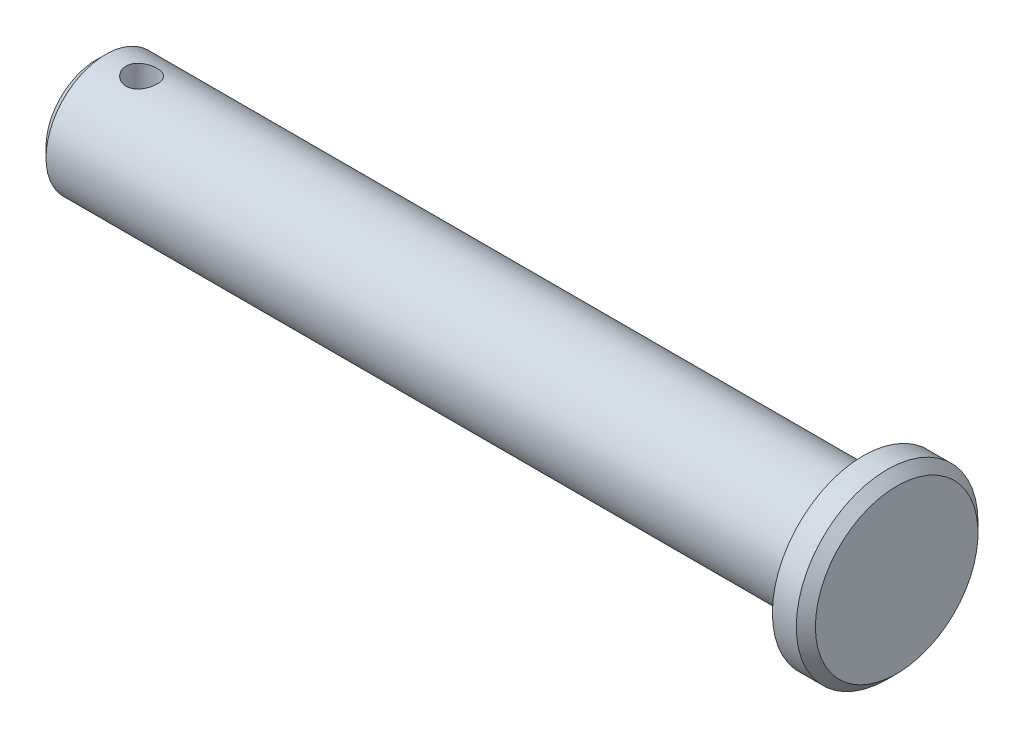
ISO-10303-21;
HEADER;
FILE_DESCRIPTION(('STEP AP214'),'2;1');
FILE_NAME('part.step','',(''),(''),'','','');
FILE_SCHEMA(('AUTOMOTIVE_DESIGN { 1 0 10303 214 1 1 1 1 }'));
ENDSEC;
DATA;
#1=APPLICATION_CONTEXT('core data for automotive mechanical design processes');
#2=APPLICATION_PROTOCOL_DEFINITION('international standard','automotive_design',2000,#1);
#3=PRODUCT_CONTEXT('',#1,'mechanical');
#4=PRODUCT('Part','Part','',(#3));
#5=PRODUCT_RELATED_PRODUCT_CATEGORY('part','',(#4));
#6=PRODUCT_DEFINITION_FORMATION('','',#4);
#7=PRODUCT_DEFINITION_CONTEXT('part definition',#1,'design');
#8=PRODUCT_DEFINITION('design','',#6,#7);
#9=PRODUCT_DEFINITION_SHAPE('','',#8);
#10=(LENGTH_UNIT() NAMED_UNIT(*) SI_UNIT(.MILLI.,.METRE.));
#11=(NAMED_UNIT(*) PLANE_ANGLE_UNIT() SI_UNIT($,.RADIAN.));
#12=(NAMED_UNIT(*) SI_UNIT($,.STERADIAN.) SOLID_ANGLE_UNIT());
#13=UNCERTAINTY_MEASURE_WITH_UNIT(LENGTH_MEASURE(1.E-05),#10,'distance_accuracy_value','');
#14=(GEOMETRIC_REPRESENTATION_CONTEXT(3) GLOBAL_UNCERTAINTY_ASSIGNED_CONTEXT((#13)) GLOBAL_UNIT_ASSIGNED_CONTEXT((#10,
#11,#12)) REPRESENTATION_CONTEXT('',''));
#15=CARTESIAN_POINT('',(0.,0.,0.));
#16=DIRECTION('',(0.,0.,1.));
#17=DIRECTION('',(1.,0.,0.));
#18=AXIS2_PLACEMENT_3D('',#15,#16,#17);
#19=CARTESIAN_POINT('',(83.69,0.,0.));
#20=DIRECTION('',(-1.,0.,0.));
#21=DIRECTION('',(0.,0.,1.));
#22=AXIS2_PLACEMENT_3D('',#19,#20,#21);
#23=PLANE('',#22);
#24=CARTESIAN_POINT('',(83.69,0.,0.));
#25=DIRECTION('',(-1.,0.,0.));
#26=DIRECTION('',(0.,0.,1.));
#27=AXIS2_PLACEMENT_3D('',#24,#25,#26);
#28=CIRCLE('',#27,17.);
#29=CARTESIAN_POINT('',(83.69,0.,17.));
#30=VERTEX_POINT('',#29);
#31=EDGE_CURVE('E10',#30,#30,#28,.T.);
#32=ORIENTED_EDGE('',*,*,#31,.F.);
#33=EDGE_LOOP('',(#32));
#34=FACE_BOUND('',#33,.T.);
#35=ADVANCED_FACE('F37',(#34),#23,.F.);
#36=CARTESIAN_POINT('',(83.69,0.,0.));
#37=DIRECTION('',(-1.,0.,0.));
#38=DIRECTION('',(0.,0.,1.));
#39=AXIS2_PLACEMENT_3D('',#36,#37,#38);
#40=CONICAL_SURFACE('',#39,17.,0.785398163397454);
#41=CARTESIAN_POINT('',(81.69,0.,0.));
#42=DIRECTION('',(-1.,0.,0.));
#43=DIRECTION('',(0.,0.,1.));
#44=AXIS2_PLACEMENT_3D('',#41,#42,#43);
#45=CIRCLE('',#44,19.);
#46=CARTESIAN_POINT('',(81.69,0.,19.));
#47=VERTEX_POINT('',#46);
#48=EDGE_CURVE('E49',#47,#47,#45,.T.);
#49=ORIENTED_EDGE('',*,*,#48,.F.);
#50=EDGE_LOOP('',(#49));
#51=FACE_BOUND('',#50,.T.);
#52=ORIENTED_EDGE('',*,*,#31,.T.);
#53=EDGE_LOOP('',(#52));
#54=FACE_BOUND('',#53,.T.);
#55=ADVANCED_FACE('F87',(#51,#54),#40,.T.);
#56=CARTESIAN_POINT('',(-83.69,0.,0.));
#57=DIRECTION('',(-1.,0.,0.));
#58=DIRECTION('',(0.,0.,1.));
#59=AXIS2_PLACEMENT_3D('',#56,#57,#58);
#60=CYLINDRICAL_SURFACE('',#59,19.);
#61=CARTESIAN_POINT('',(76.69,0.,0.));
#62=DIRECTION('',(-1.,0.,0.));
#63=DIRECTION('',(0.,0.,1.));
#64=AXIS2_PLACEMENT_3D('',#61,#62,#63);
#65=CIRCLE('',#64,19.);
#66=CARTESIAN_POINT('',(76.69,0.,19.));
#67=VERTEX_POINT('',#66);
#68=EDGE_CURVE('E54',#67,#67,#65,.T.);
#69=ORIENTED_EDGE('',*,*,#68,.F.);
#70=EDGE_LOOP('',(#69));
#71=FACE_BOUND('',#70,.T.);
#72=ORIENTED_EDGE('',*,*,#48,.T.);
#73=EDGE_LOOP('',(#72));
#74=FACE_BOUND('',#73,.T.);
#75=ADVANCED_FACE('F92',(#71,#74),#60,.T.);
#76=CARTESIAN_POINT('',(76.69,19.,0.));
#77=DIRECTION('',(1.,0.,0.));
#78=DIRECTION('',(0.,0.,-1.));
#79=AXIS2_PLACEMENT_3D('',#76,#77,#78);
#80=PLANE('',#79);
#81=CARTESIAN_POINT('',(76.69,0.,0.));
#82=DIRECTION('',(-1.,0.,0.));
#83=DIRECTION('',(0.,0.,1.));
#84=AXIS2_PLACEMENT_3D('',#81,#82,#83);
#85=CIRCLE('',#84,12.5);
#86=CARTESIAN_POINT('',(76.69,0.,12.5));
#87=VERTEX_POINT('',#86);
#88=EDGE_CURVE('E106',#87,#87,#85,.T.);
#89=ORIENTED_EDGE('',*,*,#88,.F.);
#90=EDGE_LOOP('',(#89));
#91=FACE_BOUND('',#90,.T.);
#92=ORIENTED_EDGE('',*,*,#68,.T.);
#93=EDGE_LOOP('',(#92));
#94=FACE_BOUND('',#93,.T.);
#95=ADVANCED_FACE('F82',(#91,#94),#80,.F.);
#96=CARTESIAN_POINT('',(-83.69,0.,0.));
#97=DIRECTION('',(-1.,0.,0.));
#98=DIRECTION('',(0.,0.,1.));
#99=AXIS2_PLACEMENT_3D('',#96,#97,#98);
#100=CYLINDRICAL_SURFACE('',#99,12.5);
#101=CARTESIAN_POINT('',(-74.19,-12.0701077045733,3.25000000000001));
#102=CARTESIAN_POINT('',(-74.0107885954813,-12.0701109573982,3.24999535178113));
#103=CARTESIAN_POINT('',(-73.8315271110855,-12.0741425908511,3.23512639697315));
#104=CARTESIAN_POINT('',(-73.4781693023618,-12.0897881676305,3.17614884790338));
#105=CARTESIAN_POINT('',(-73.3040757890962,-12.1014061612356,3.13202463437075));
#106=CARTESIAN_POINT('',(-72.9662164630232,-12.1308216935703,3.01607533822269));
#107=CARTESIAN_POINT('',(-72.8024369652352,-12.1486108310136,2.94428790118148));
#108=CARTESIAN_POINT('',(-72.4892235998337,-12.188353656464,2.77516657772717));
#109=CARTESIAN_POINT('',(-72.3397906438448,-12.210307608853,2.6778310693744));
#110=CARTESIAN_POINT('',(-72.0559577814269,-12.2564913332899,2.45790196762269));
#111=CARTESIAN_POINT('',(-71.9219495733315,-12.280759850753,2.33481089596256));
#112=CARTESIAN_POINT('',(-71.6762280196932,-12.3285031518504,2.06793534575671));
#113=CARTESIAN_POINT('',(-71.5645168911415,-12.3519778563635,1.92414881191203));
#114=CARTESIAN_POINT('',(-71.3649397364803,-12.3959194289913,1.61726111047983));
#115=CARTESIAN_POINT('',(-71.2774612447029,-12.4163352528835,1.45389997653955));
#116=CARTESIAN_POINT('',(-71.1313568196019,-12.4514152229144,1.11417056289528));
#117=CARTESIAN_POINT('',(-71.0727262699012,-12.4660802892388,0.937804369516636));
#118=CARTESIAN_POINT('',(-70.9872444185742,-12.4877324473615,0.581157741498521));
#119=CARTESIAN_POINT('',(-70.9597272679288,-12.4948801723699,0.401046821083342));
#120=CARTESIAN_POINT('',(-70.9351604063271,-12.5012531662289,0.0386327508821765));
#121=CARTESIAN_POINT('',(-70.9381058382885,-12.5004796980681,-0.143670044792213));
#122=CARTESIAN_POINT('',(-70.9739075642838,-12.4912159156495,-0.50066512385632));
#123=CARTESIAN_POINT('',(-71.0060447432983,-12.4829111371108,-0.6754350698673));
#124=CARTESIAN_POINT('',(-71.0981583408352,-12.4597356136684,-1.0170108145033));
#125=CARTESIAN_POINT('',(-71.1581363058879,-12.4448645040133,-1.18381617013483));
#126=CARTESIAN_POINT('',(-71.3047924979954,-12.4099485405509,-1.50658740876954));
#127=CARTESIAN_POINT('',(-71.3917209788508,-12.3898554928598,-1.66243415738996));
#128=CARTESIAN_POINT('',(-71.5896194759968,-12.3466665928588,-1.9575762183214));
#129=CARTESIAN_POINT('',(-71.7005939759614,-12.3235701808565,-2.09686843632711));
#130=CARTESIAN_POINT('',(-71.9472671863206,-12.2760868825507,-2.35923845302994));
#131=CARTESIAN_POINT('',(-72.08359361736,-12.2516820085968,-2.48172349723348));
#132=CARTESIAN_POINT('',(-72.3751060251362,-12.2049448337488,-2.702232859288));
#133=CARTESIAN_POINT('',(-72.5302930370178,-12.1826126467309,-2.80025583365963));
#134=CARTESIAN_POINT('',(-72.8563566235132,-12.1424802811445,-2.96948026869847));
#135=CARTESIAN_POINT('',(-73.0273163418386,-12.1247062331819,-3.04052815701658));
#136=CARTESIAN_POINT('',(-73.3793297967005,-12.0960312749224,-3.15268381624372));
#137=CARTESIAN_POINT('',(-73.5603811605704,-12.0851287564037,-3.19379859308707));
#138=CARTESIAN_POINT('',(-73.9219138101008,-12.0717718519797,-3.24391476190108));
#139=CARTESIAN_POINT('',(-74.1022645433665,-12.0690857581667,-3.25379719756266));
#140=CARTESIAN_POINT('',(-74.4620402014958,-12.0718332019216,-3.24358933567582));
#141=CARTESIAN_POINT('',(-74.6414652175856,-12.0772659234555,-3.22350205042832));
#142=CARTESIAN_POINT('',(-74.9909519843272,-12.0954157697153,-3.15469998588877));
#143=CARTESIAN_POINT('',(-75.1611242389842,-12.1079997596083,-3.10650801182699));
#144=CARTESIAN_POINT('',(-75.4909723579425,-12.1389056713158,-2.98344905344029));
#145=CARTESIAN_POINT('',(-75.6506468993668,-12.1572283146206,-2.90857871482456));
#146=CARTESIAN_POINT('',(-75.9586722501889,-12.1980276011193,-2.73247717350931));
#147=CARTESIAN_POINT('',(-76.1067143520271,-12.2205834904775,-2.63072477625171));
#148=CARTESIAN_POINT('',(-76.3839462489922,-12.2671181282773,-2.4043987998912));
#149=CARTESIAN_POINT('',(-76.5131326744878,-12.2910971299641,-2.27982115071729));
#150=CARTESIAN_POINT('',(-76.7526073691843,-12.3385688083207,-2.00731864410624));
#151=CARTESIAN_POINT('',(-76.8622832262937,-12.3620303224023,-1.85884911980557));
#152=CARTESIAN_POINT('',(-77.0551513294656,-12.4051491994823,-1.54509249859946));
#153=CARTESIAN_POINT('',(-77.1383449788849,-12.4248067640396,-1.37980629346376));
#154=CARTESIAN_POINT('',(-77.2751385963343,-12.4579769251599,-1.03826690311396));
#155=CARTESIAN_POINT('',(-77.3289567863995,-12.471534699114,-0.86210571803438));
#156=CARTESIAN_POINT('',(-77.4061145152478,-12.4911761164616,-0.502837049160071));
#157=CARTESIAN_POINT('',(-77.4294604508988,-12.4972613285118,-0.319731031562752));
#158=CARTESIAN_POINT('',(-77.4446267651941,-12.5012019892906,0.042495413320657));
#159=CARTESIAN_POINT('',(-77.4373476432301,-12.4992925217517,0.221576127725296));
#160=CARTESIAN_POINT('',(-77.3935498152793,-12.4879858018465,0.575871036634166));
#161=CARTESIAN_POINT('',(-77.3570321118936,-12.4785888062302,0.751085363506481));
#162=CARTESIAN_POINT('',(-77.2562925313222,-12.4534054132527,1.09164766573276));
#163=CARTESIAN_POINT('',(-77.1922453146038,-12.4376593358794,1.257050484072));
#164=CARTESIAN_POINT('',(-77.0384215044186,-12.4014288567053,1.57485660758888));
#165=CARTESIAN_POINT('',(-76.9486414449483,-12.3809438166767,1.7272581580113));
#166=CARTESIAN_POINT('',(-76.7432198655677,-12.3367798925157,2.01895989700419));
#167=CARTESIAN_POINT('',(-76.6269755695591,-12.3130327153406,2.15782524431701));
#168=CARTESIAN_POINT('',(-76.3730795014073,-12.2653095573742,2.41438331885254));
#169=CARTESIAN_POINT('',(-76.2354221916498,-12.2413335189069,2.53207055217989));
#170=CARTESIAN_POINT('',(-75.9391930313259,-12.1953008053636,2.74532550015592));
#171=CARTESIAN_POINT('',(-75.7802485671912,-12.1732938799442,2.84038727425697));
#172=CARTESIAN_POINT('',(-75.4480819265396,-12.1343795273366,3.0023016148278));
#173=CARTESIAN_POINT('',(-75.2748696190876,-12.1174686123345,3.06917348760505));
#174=CARTESIAN_POINT('',(-74.950129694205,-12.0931300782527,3.16356306125911));
#175=CARTESIAN_POINT('',(-74.8000714178756,-12.0845645189861,3.19590306708418));
#176=CARTESIAN_POINT('',(-74.4966874302689,-12.0730522257394,3.23912243522354));
#177=CARTESIAN_POINT('',(-74.3433620525361,-12.070104920934,3.25000397776242));
#178=CARTESIAN_POINT('',(-74.19,-12.0701077045733,3.25000000000001));
#179=B_SPLINE_CURVE_WITH_KNOTS('',3,(#101,#102,#103,#104,#105,#106,#107,#108,#109,#110,#111,
#112,#113,#114,#115,#116,#117,#118,#119,#120,#121,#122,#123,#124,#125,#126,#127,#128,#129,#130,
#131,#132,#133,#134,#135,#136,#137,#138,#139,#140,#141,#142,#143,#144,#145,#146,#147,#148,#149,
#150,#151,#152,#153,#154,#155,#156,#157,#158,#159,#160,#161,#162,#163,#164,#165,#166,#167,#168,
#169,#170,#171,#172,#173,#174,#175,#176,#177,#178),.UNSPECIFIED.,.T.,.F.,(4,2,2,2,2,2,2,2,2,2,2,
2,2,2,2,2,2,2,2,2,2,2,2,2,2,2,2,2,2,2,2,2,2,2,2,2,2,2,4),(0.,0.537070585366152,1.07442814181089,
1.61105700156233,2.14771993786828,2.69590642873234,3.2441473984725,3.80070711961765,
4.35717774859145,4.90149970278471,5.44573486933554,5.97691640068851,6.50812744222307,
7.04442685876538,7.58082636107377,8.13290034432251,8.6850046413125,9.240206612548,
9.79527859528774,10.3345457987712,10.8737588033625,11.4032475650857,11.9328029233325,
12.4734934119642,13.0142804074905,13.5698352862046,14.125360719806,14.67670111084,
15.2279257434832,15.7630571972261,16.2981703019111,16.8299373742636,17.3617761049811,
17.9072189278757,18.4528030428377,19.0096330020194,19.5660809852347,20.025731515924,
20.4853353427546),.UNSPECIFIED.);
#180=CARTESIAN_POINT('',(-74.19,-12.0701077045733,3.25000000000001));
#181=VERTEX_POINT('',#180);
#182=EDGE_CURVE('E40',#181,#181,#179,.T.);
#183=ORIENTED_EDGE('',*,*,#182,.T.);
#184=EDGE_LOOP('',(#183));
#185=FACE_BOUND('',#184,.T.);
#186=CARTESIAN_POINT('',(-74.19,12.0701077045733,3.25000000000001));
#187=CARTESIAN_POINT('',(-74.3692114045187,12.0701109573982,3.24999535178113));
#188=CARTESIAN_POINT('',(-74.5484728889145,12.0741425908511,3.23512639697315));
#189=CARTESIAN_POINT('',(-74.9018306976382,12.0897881676305,3.17614884790338));
#190=CARTESIAN_POINT('',(-75.0759242109038,12.1014061612356,3.13202463437075));
#191=CARTESIAN_POINT('',(-75.4137835369768,12.1308216935703,3.01607533822269));
#192=CARTESIAN_POINT('',(-75.5775630347649,12.1486108310136,2.94428790118148));
#193=CARTESIAN_POINT('',(-75.8907764001663,12.188353656464,2.77516657772717));
#194=CARTESIAN_POINT('',(-76.0402093561552,12.210307608853,2.6778310693744));
#195=CARTESIAN_POINT('',(-76.3240422185731,12.2564913332899,2.45790196762269));
#196=CARTESIAN_POINT('',(-76.4580504266685,12.280759850753,2.33481089596256));
#197=CARTESIAN_POINT('',(-76.7037719803068,12.3285031518504,2.06793534575671));
#198=CARTESIAN_POINT('',(-76.8154831088586,12.3519778563635,1.92414881191203));
#199=CARTESIAN_POINT('',(-77.0150602635197,12.3959194289913,1.61726111047983));
#200=CARTESIAN_POINT('',(-77.1025387552971,12.4163352528835,1.45389997653955));
#201=CARTESIAN_POINT('',(-77.2486431803981,12.4514152229144,1.11417056289528));
#202=CARTESIAN_POINT('',(-77.3072737300988,12.4660802892388,0.937804369516634));
#203=CARTESIAN_POINT('',(-77.3927555814258,12.4877324473615,0.581157741498521));
#204=CARTESIAN_POINT('',(-77.4202727320712,12.4948801723699,0.401046821083342));
#205=CARTESIAN_POINT('',(-77.4448395936729,12.5012531662289,0.0386327508821765));
#206=CARTESIAN_POINT('',(-77.4418941617116,12.5004796980681,-0.143670044792213));
#207=CARTESIAN_POINT('',(-77.4060924357162,12.4912159156495,-0.50066512385632));
#208=CARTESIAN_POINT('',(-77.3739552567017,12.4829111371108,-0.6754350698673));
#209=CARTESIAN_POINT('',(-77.2818416591648,12.4597356136684,-1.0170108145033));
#210=CARTESIAN_POINT('',(-77.2218636941121,12.4448645040133,-1.18381617013483));
#211=CARTESIAN_POINT('',(-77.0752075020046,12.4099485405509,-1.50658740876954));
#212=CARTESIAN_POINT('',(-76.9882790211492,12.3898554928598,-1.66243415738996));
#213=CARTESIAN_POINT('',(-76.7903805240032,12.3466665928588,-1.9575762183214));
#214=CARTESIAN_POINT('',(-76.6794060240386,12.3235701808565,-2.09686843632711));
#215=CARTESIAN_POINT('',(-76.4327328136794,12.2760868825507,-2.35923845302994));
#216=CARTESIAN_POINT('',(-76.2964063826401,12.2516820085968,-2.48172349723348));
#217=CARTESIAN_POINT('',(-76.0048939748638,12.2049448337488,-2.702232859288));
#218=CARTESIAN_POINT('',(-75.8497069629822,12.1826126467309,-2.80025583365963));
#219=CARTESIAN_POINT('',(-75.5236433764868,12.1424802811445,-2.96948026869847));
#220=CARTESIAN_POINT('',(-75.3526836581614,12.1247062331819,-3.04052815701658));
#221=CARTESIAN_POINT('',(-75.0006702032995,12.0960312749224,-3.15268381624372));
#222=CARTESIAN_POINT('',(-74.8196188394296,12.0851287564037,-3.19379859308707));
#223=CARTESIAN_POINT('',(-74.4580861898992,12.0717718519797,-3.24391476190108));
#224=CARTESIAN_POINT('',(-74.2777354566335,12.0690857581667,-3.25379719756266));
#225=CARTESIAN_POINT('',(-73.9179597985042,12.0718332019216,-3.24358933567582));
#226=CARTESIAN_POINT('',(-73.7385347824144,12.0772659234555,-3.22350205042832));
#227=CARTESIAN_POINT('',(-73.3890480156728,12.0954157697153,-3.15469998588877));
#228=CARTESIAN_POINT('',(-73.2188757610158,12.1079997596083,-3.10650801182699));
#229=CARTESIAN_POINT('',(-72.8890276420575,12.1389056713158,-2.98344905344029));
#230=CARTESIAN_POINT('',(-72.7293531006332,12.1572283146205,-2.90857871482456));
#231=CARTESIAN_POINT('',(-72.4213277498111,12.1980276011193,-2.73247717350931));
#232=CARTESIAN_POINT('',(-72.2732856479729,12.2205834904775,-2.63072477625172));
#233=CARTESIAN_POINT('',(-71.9960537510078,12.2671181282773,-2.4043987998912));
#234=CARTESIAN_POINT('',(-71.8668673255122,12.2910971299641,-2.27982115071729));
#235=CARTESIAN_POINT('',(-71.6273926308157,12.3385688083207,-2.00731864410624));
#236=CARTESIAN_POINT('',(-71.5177167737063,12.3620303224023,-1.85884911980557));
#237=CARTESIAN_POINT('',(-71.3248486705344,12.4051491994823,-1.54509249859946));
#238=CARTESIAN_POINT('',(-71.2416550211151,12.4248067640396,-1.37980629346376));
#239=CARTESIAN_POINT('',(-71.1048614036657,12.4579769251599,-1.03826690311396));
#240=CARTESIAN_POINT('',(-71.0510432136005,12.471534699114,-0.86210571803438));
#241=CARTESIAN_POINT('',(-70.9738854847522,12.4911761164616,-0.502837049160071));
#242=CARTESIAN_POINT('',(-70.9505395491013,12.4972613285118,-0.319731031562752));
#243=CARTESIAN_POINT('',(-70.9353732348059,12.5012019892906,0.0424954133206558));
#244=CARTESIAN_POINT('',(-70.9426523567699,12.4992925217517,0.221576127725293));
#245=CARTESIAN_POINT('',(-70.9864501847208,12.4879858018465,0.575871036634164));
#246=CARTESIAN_POINT('',(-71.0229678881064,12.4785888062302,0.75108536350648));
#247=CARTESIAN_POINT('',(-71.1237074686778,12.4534054132527,1.09164766573276));
#248=CARTESIAN_POINT('',(-71.1877546853962,12.4376593358794,1.257050484072));
#249=CARTESIAN_POINT('',(-71.3415784955814,12.4014288567053,1.57485660758888));
#250=CARTESIAN_POINT('',(-71.4313585550517,12.3809438166767,1.7272581580113));
#251=CARTESIAN_POINT('',(-71.6367801344324,12.3367798925157,2.01895989700419));
#252=CARTESIAN_POINT('',(-71.7530244304409,12.3130327153406,2.157825244317));
#253=CARTESIAN_POINT('',(-72.0069204985927,12.2653095573742,2.41438331885253));
#254=CARTESIAN_POINT('',(-72.1445778083502,12.2413335189069,2.53207055217989));
#255=CARTESIAN_POINT('',(-72.4408069686741,12.1953008053636,2.74532550015592));
#256=CARTESIAN_POINT('',(-72.5997514328088,12.1732938799442,2.84038727425697));
#257=CARTESIAN_POINT('',(-72.9319180734605,12.1343795273366,3.0023016148278));
#258=CARTESIAN_POINT('',(-73.1051303809124,12.1174686123345,3.06917348760505));
#259=CARTESIAN_POINT('',(-73.429870305795,12.0931300782527,3.16356306125911));
#260=CARTESIAN_POINT('',(-73.5799285821244,12.0845645189861,3.19590306708418));
#261=CARTESIAN_POINT('',(-73.8833125697311,12.0730522257394,3.23912243522354));
#262=CARTESIAN_POINT('',(-74.036637947464,12.070104920934,3.25000397776242));
#263=CARTESIAN_POINT('',(-74.19,12.0701077045733,3.25000000000001));
#264=B_SPLINE_CURVE_WITH_KNOTS('',3,(#186,#187,#188,#189,#190,#191,#192,#193,#194,#195,#196,
#197,#198,#199,#200,#201,#202,#203,#204,#205,#206,#207,#208,#209,#210,#211,#212,#213,#214,#215,
#216,#217,#218,#219,#220,#221,#222,#223,#224,#225,#226,#227,#228,#229,#230,#231,#232,#233,#234,
#235,#236,#237,#238,#239,#240,#241,#242,#243,#244,#245,#246,#247,#248,#249,#250,#251,#252,#253,
#254,#255,#256,#257,#258,#259,#260,#261,#262,#263),.UNSPECIFIED.,.T.,.F.,(4,2,2,2,2,2,2,2,2,2,2,
2,2,2,2,2,2,2,2,2,2,2,2,2,2,2,2,2,2,2,2,2,2,2,2,2,2,2,4),(0.,0.537070585366152,1.07442814181089,
1.61105700156233,2.14771993786828,2.69590642873234,3.2441473984725,3.80070711961765,
4.35717774859145,4.90149970278471,5.44573486933554,5.97691640068851,6.50812744222307,
7.04442685876538,7.58082636107377,8.13290034432251,8.6850046413125,9.240206612548,
9.79527859528774,10.3345457987712,10.8737588033625,11.4032475650856,11.9328029233325,
12.4734934119642,13.0142804074905,13.5698352862046,14.125360719806,14.67670111084,
15.2279257434832,15.7630571972261,16.2981703019111,16.8299373742636,17.3617761049811,
17.9072189278757,18.4528030428377,19.0096330020194,19.5660809852347,20.025731515924,
20.4853353427546),.UNSPECIFIED.);
#265=CARTESIAN_POINT('',(-74.19,12.0701077045733,3.25000000000001));
#266=VERTEX_POINT('',#265);
#267=EDGE_CURVE('E57',#266,#266,#264,.T.);
#268=ORIENTED_EDGE('',*,*,#267,.T.);
#269=EDGE_LOOP('',(#268));
#270=FACE_BOUND('',#269,.T.);
#271=CARTESIAN_POINT('',(-81.69,0.,0.));
#272=DIRECTION('',(-1.,0.,0.));
#273=DIRECTION('',(0.,0.,1.));
#274=AXIS2_PLACEMENT_3D('',#271,#272,#273);
#275=CIRCLE('',#274,12.5);
#276=CARTESIAN_POINT('',(-81.69,0.,12.5));
#277=VERTEX_POINT('',#276);
#278=EDGE_CURVE('E109',#277,#277,#275,.T.);
#279=ORIENTED_EDGE('',*,*,#278,.F.);
#280=EDGE_LOOP('',(#279));
#281=FACE_BOUND('',#280,.T.);
#282=ORIENTED_EDGE('',*,*,#88,.T.);
#283=EDGE_LOOP('',(#282));
#284=FACE_BOUND('',#283,.T.);
#285=ADVANCED_FACE('F62',(#185,#270,#281,#284),#100,.T.);
#286=CARTESIAN_POINT('',(-81.69,0.,0.));
#287=DIRECTION('',(1.,0.,0.));
#288=DIRECTION('',(0.,0.,-1.));
#289=AXIS2_PLACEMENT_3D('',#286,#287,#288);
#290=CONICAL_SURFACE('',#289,12.5,0.785398163397448);
#291=CARTESIAN_POINT('',(-83.69,0.,0.));
#292=DIRECTION('',(-1.,0.,0.));
#293=DIRECTION('',(0.,0.,1.));
#294=AXIS2_PLACEMENT_3D('',#291,#292,#293);
#295=CIRCLE('',#294,10.5);
#296=CARTESIAN_POINT('',(-83.69,0.,10.5));
#297=VERTEX_POINT('',#296);
#298=EDGE_CURVE('E114',#297,#297,#295,.T.);
#299=ORIENTED_EDGE('',*,*,#298,.F.);
#300=EDGE_LOOP('',(#299));
#301=FACE_BOUND('',#300,.T.);
#302=ORIENTED_EDGE('',*,*,#278,.T.);
#303=EDGE_LOOP('',(#302));
#304=FACE_BOUND('',#303,.T.);
#305=ADVANCED_FACE('F74',(#301,#304),#290,.T.);
#306=CARTESIAN_POINT('',(-83.69,10.5,0.));
#307=DIRECTION('',(1.,0.,0.));
#308=DIRECTION('',(0.,0.,-1.));
#309=AXIS2_PLACEMENT_3D('',#306,#307,#308);
#310=PLANE('',#309);
#311=ORIENTED_EDGE('',*,*,#298,.T.);
#312=EDGE_LOOP('',(#311));
#313=FACE_BOUND('',#312,.T.);
#314=ADVANCED_FACE('F70',(#313),#310,.F.);
#315=CARTESIAN_POINT('',(-74.19,-19.,0.));
#316=DIRECTION('',(0.,1.,0.));
#317=DIRECTION('',(0.,0.,1.));
#318=AXIS2_PLACEMENT_3D('',#315,#316,#317);
#319=CYLINDRICAL_SURFACE('',#318,3.25000000000001);
#320=ORIENTED_EDGE('',*,*,#267,.F.);
#321=EDGE_LOOP('',(#320));
#322=FACE_BOUND('',#321,.T.);
#323=ORIENTED_EDGE('',*,*,#182,.F.);
#324=EDGE_LOOP('',(#323));
#325=FACE_BOUND('',#324,.T.);
#326=ADVANCED_FACE('F66',(#322,#325),#319,.F.);
#327=CLOSED_SHELL('',(#35,#55,#75,#95,#285,#305,#314,#326));
#328=MANIFOLD_SOLID_BREP('B2',#327);
#329=ADVANCED_BREP_SHAPE_REPRESENTATION('',(#18,#328),#14);
#330=SHAPE_DEFINITION_REPRESENTATION(#9,#329);
ENDSEC;
END-ISO-10303-21;
